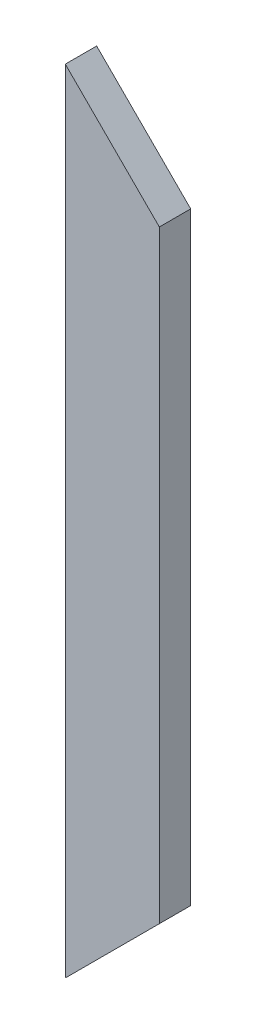
ISO-10303-21;
HEADER;
FILE_DESCRIPTION(('STEP AP214'),'2;1');
FILE_NAME('part.step','',(''),(''),'','','');
FILE_SCHEMA(('AUTOMOTIVE_DESIGN { 1 0 10303 214 1 1 1 1 }'));
ENDSEC;
DATA;
#1=APPLICATION_CONTEXT('core data for automotive mechanical design processes');
#2=APPLICATION_PROTOCOL_DEFINITION('international standard','automotive_design',2000,#1);
#3=PRODUCT_CONTEXT('',#1,'mechanical');
#4=PRODUCT('Part','Part','',(#3));
#5=PRODUCT_RELATED_PRODUCT_CATEGORY('part','',(#4));
#6=PRODUCT_DEFINITION_FORMATION('','',#4);
#7=PRODUCT_DEFINITION_CONTEXT('part definition',#1,'design');
#8=PRODUCT_DEFINITION('design','',#6,#7);
#9=PRODUCT_DEFINITION_SHAPE('','',#8);
#10=(LENGTH_UNIT() NAMED_UNIT(*) SI_UNIT(.MILLI.,.METRE.));
#11=(NAMED_UNIT(*) PLANE_ANGLE_UNIT() SI_UNIT($,.RADIAN.));
#12=(NAMED_UNIT(*) SI_UNIT($,.STERADIAN.) SOLID_ANGLE_UNIT());
#13=UNCERTAINTY_MEASURE_WITH_UNIT(LENGTH_MEASURE(1.E-05),#10,'distance_accuracy_value','');
#14=(GEOMETRIC_REPRESENTATION_CONTEXT(3) GLOBAL_UNCERTAINTY_ASSIGNED_CONTEXT((#13)) GLOBAL_UNIT_ASSIGNED_CONTEXT((#10,
#11,#12)) REPRESENTATION_CONTEXT('',''));
#15=CARTESIAN_POINT('',(0.,0.,0.));
#16=DIRECTION('',(0.,0.,1.));
#17=DIRECTION('',(1.,0.,0.));
#18=AXIS2_PLACEMENT_3D('',#15,#16,#17);
#19=CARTESIAN_POINT('',(38.1,-320.675,25.4));
#20=DIRECTION('',(-1.,0.,0.));
#21=DIRECTION('',(0.,0.,1.));
#22=AXIS2_PLACEMENT_3D('',#19,#20,#21);
#23=PLANE('',#22);
#24=DIRECTION('',(0.,1.,0.));
#25=VECTOR('',#24,1.);
#26=CARTESIAN_POINT('',(38.1,-320.675,0.));
#27=LINE('',#26,#25);
#28=CARTESIAN_POINT('',(38.1,-244.475,0.));
#29=VERTEX_POINT('',#28);
#30=CARTESIAN_POINT('',(38.1,244.475000000001,0.));
#31=VERTEX_POINT('',#30);
#32=EDGE_CURVE('E88',#29,#31,#27,.T.);
#33=ORIENTED_EDGE('',*,*,#32,.T.);
#34=DIRECTION('',(0.,0.,1.));
#35=VECTOR('',#34,1.);
#36=CARTESIAN_POINT('',(38.1,244.475000000001,0.));
#37=LINE('',#36,#35);
#38=CARTESIAN_POINT('',(38.1,244.475000000001,25.4));
#39=VERTEX_POINT('',#38);
#40=EDGE_CURVE('E47',#31,#39,#37,.T.);
#41=ORIENTED_EDGE('',*,*,#40,.T.);
#42=DIRECTION('',(0.,1.,0.));
#43=VECTOR('',#42,1.);
#44=CARTESIAN_POINT('',(38.1,-320.675,25.4));
#45=LINE('',#44,#43);
#46=CARTESIAN_POINT('',(38.1,-244.475,25.4));
#47=VERTEX_POINT('',#46);
#48=EDGE_CURVE('E87',#47,#39,#45,.T.);
#49=ORIENTED_EDGE('',*,*,#48,.F.);
#50=DIRECTION('',(0.,0.,1.));
#51=VECTOR('',#50,1.);
#52=CARTESIAN_POINT('',(38.1,-244.475,0.));
#53=LINE('',#52,#51);
#54=EDGE_CURVE('E92',#29,#47,#53,.T.);
#55=ORIENTED_EDGE('',*,*,#54,.F.);
#56=EDGE_LOOP('',(#33,#41,#49,#55));
#57=FACE_BOUND('',#56,.T.);
#58=ADVANCED_FACE('F33',(#57),#23,.F.);
#59=CARTESIAN_POINT('',(-38.1,-320.675,25.4));
#60=DIRECTION('',(1.,0.,0.));
#61=DIRECTION('',(0.,0.,-1.));
#62=AXIS2_PLACEMENT_3D('',#59,#60,#61);
#63=PLANE('',#62);
#64=DIRECTION('',(0.,-1.,0.));
#65=VECTOR('',#64,1.);
#66=CARTESIAN_POINT('',(-38.1,-320.675,0.));
#67=LINE('',#66,#65);
#68=CARTESIAN_POINT('',(-38.1,320.675,0.));
#69=VERTEX_POINT('',#68);
#70=CARTESIAN_POINT('',(-38.1,-320.675,0.));
#71=VERTEX_POINT('',#70);
#72=EDGE_CURVE('E82',#69,#71,#67,.T.);
#73=ORIENTED_EDGE('',*,*,#72,.T.);
#74=DIRECTION('',(0.,0.,-1.));
#75=VECTOR('',#74,1.);
#76=CARTESIAN_POINT('',(-38.1,-320.675,25.4));
#77=LINE('',#76,#75);
#78=CARTESIAN_POINT('',(-38.1,-320.675,25.4));
#79=VERTEX_POINT('',#78);
#80=EDGE_CURVE('E40',#79,#71,#77,.T.);
#81=ORIENTED_EDGE('',*,*,#80,.F.);
#82=DIRECTION('',(0.,-1.,0.));
#83=VECTOR('',#82,1.);
#84=CARTESIAN_POINT('',(-38.1,-320.675,25.4));
#85=LINE('',#84,#83);
#86=CARTESIAN_POINT('',(-38.1,320.675,25.4));
#87=VERTEX_POINT('',#86);
#88=EDGE_CURVE('E84',#87,#79,#85,.T.);
#89=ORIENTED_EDGE('',*,*,#88,.F.);
#90=DIRECTION('',(0.,0.,-1.));
#91=VECTOR('',#90,1.);
#92=CARTESIAN_POINT('',(-38.1,320.675,25.4));
#93=LINE('',#92,#91);
#94=EDGE_CURVE('E11',#87,#69,#93,.T.);
#95=ORIENTED_EDGE('',*,*,#94,.T.);
#96=EDGE_LOOP('',(#73,#81,#89,#95));
#97=FACE_BOUND('',#96,.T.);
#98=ADVANCED_FACE('F81',(#97),#63,.F.);
#99=CARTESIAN_POINT('',(0.,0.,25.4));
#100=DIRECTION('',(0.,0.,-1.));
#101=DIRECTION('',(-1.,0.,0.));
#102=AXIS2_PLACEMENT_3D('',#99,#100,#101);
#103=PLANE('',#102);
#104=ORIENTED_EDGE('',*,*,#48,.T.);
#105=DIRECTION('',(0.707106781186552,-0.707106781186543,0.));
#106=VECTOR('',#105,1.);
#107=CARTESIAN_POINT('',(-38.1,320.675,25.4));
#108=LINE('',#107,#106);
#109=EDGE_CURVE('E76',#87,#39,#108,.T.);
#110=ORIENTED_EDGE('',*,*,#109,.F.);
#111=ORIENTED_EDGE('',*,*,#88,.T.);
#112=DIRECTION('',(-0.707106781186546,-0.707106781186549,0.));
#113=VECTOR('',#112,1.);
#114=CARTESIAN_POINT('',(-38.1,-320.675,25.4));
#115=LINE('',#114,#113);
#116=EDGE_CURVE('E99',#47,#79,#115,.T.);
#117=ORIENTED_EDGE('',*,*,#116,.F.);
#118=EDGE_LOOP('',(#104,#110,#111,#117));
#119=FACE_BOUND('',#118,.T.);
#120=ADVANCED_FACE('F106',(#119),#103,.F.);
#121=CARTESIAN_POINT('',(0.,0.,0.));
#122=DIRECTION('',(0.,0.,-1.));
#123=DIRECTION('',(-1.,0.,0.));
#124=AXIS2_PLACEMENT_3D('',#121,#122,#123);
#125=PLANE('',#124);
#126=DIRECTION('',(0.707106781186552,-0.707106781186543,0.));
#127=VECTOR('',#126,1.);
#128=CARTESIAN_POINT('',(-38.1,320.675,0.));
#129=LINE('',#128,#127);
#130=EDGE_CURVE('E69',#69,#31,#129,.T.);
#131=ORIENTED_EDGE('',*,*,#130,.T.);
#132=ORIENTED_EDGE('',*,*,#32,.F.);
#133=DIRECTION('',(-0.707106781186546,-0.707106781186549,0.));
#134=VECTOR('',#133,1.);
#135=CARTESIAN_POINT('',(-38.1,-320.675,0.));
#136=LINE('',#135,#134);
#137=EDGE_CURVE('E86',#29,#71,#136,.T.);
#138=ORIENTED_EDGE('',*,*,#137,.T.);
#139=ORIENTED_EDGE('',*,*,#72,.F.);
#140=EDGE_LOOP('',(#131,#132,#138,#139));
#141=FACE_BOUND('',#140,.T.);
#142=ADVANCED_FACE('F85',(#141),#125,.T.);
#143=CARTESIAN_POINT('',(-38.1,-320.675,0.));
#144=DIRECTION('',(-0.707106781186549,0.707106781186546,0.));
#145=DIRECTION('',(-0.707106781186546,-0.707106781186549,0.));
#146=AXIS2_PLACEMENT_3D('',#143,#144,#145);
#147=PLANE('',#146);
#148=ORIENTED_EDGE('',*,*,#116,.T.);
#149=ORIENTED_EDGE('',*,*,#80,.T.);
#150=ORIENTED_EDGE('',*,*,#137,.F.);
#151=ORIENTED_EDGE('',*,*,#54,.T.);
#152=EDGE_LOOP('',(#148,#149,#150,#151));
#153=FACE_BOUND('',#152,.T.);
#154=ADVANCED_FACE('F107',(#153),#147,.F.);
#155=CARTESIAN_POINT('',(-38.1,320.675,0.));
#156=DIRECTION('',(-0.707106781186543,-0.707106781186551,0.));
#157=DIRECTION('',(0.707106781186552,-0.707106781186544,0.));
#158=AXIS2_PLACEMENT_3D('',#155,#156,#157);
#159=PLANE('',#158);
#160=ORIENTED_EDGE('',*,*,#109,.T.);
#161=ORIENTED_EDGE('',*,*,#40,.F.);
#162=ORIENTED_EDGE('',*,*,#130,.F.);
#163=ORIENTED_EDGE('',*,*,#94,.F.);
#164=EDGE_LOOP('',(#160,#161,#162,#163));
#165=FACE_BOUND('',#164,.T.);
#166=ADVANCED_FACE('F70',(#165),#159,.F.);
#167=CLOSED_SHELL('',(#58,#98,#120,#142,#154,#166));
#168=MANIFOLD_SOLID_BREP('B2',#167);
#169=ADVANCED_BREP_SHAPE_REPRESENTATION('',(#18,#168),#14);
#170=SHAPE_DEFINITION_REPRESENTATION(#9,#169);
ENDSEC;
END-ISO-10303-21;
